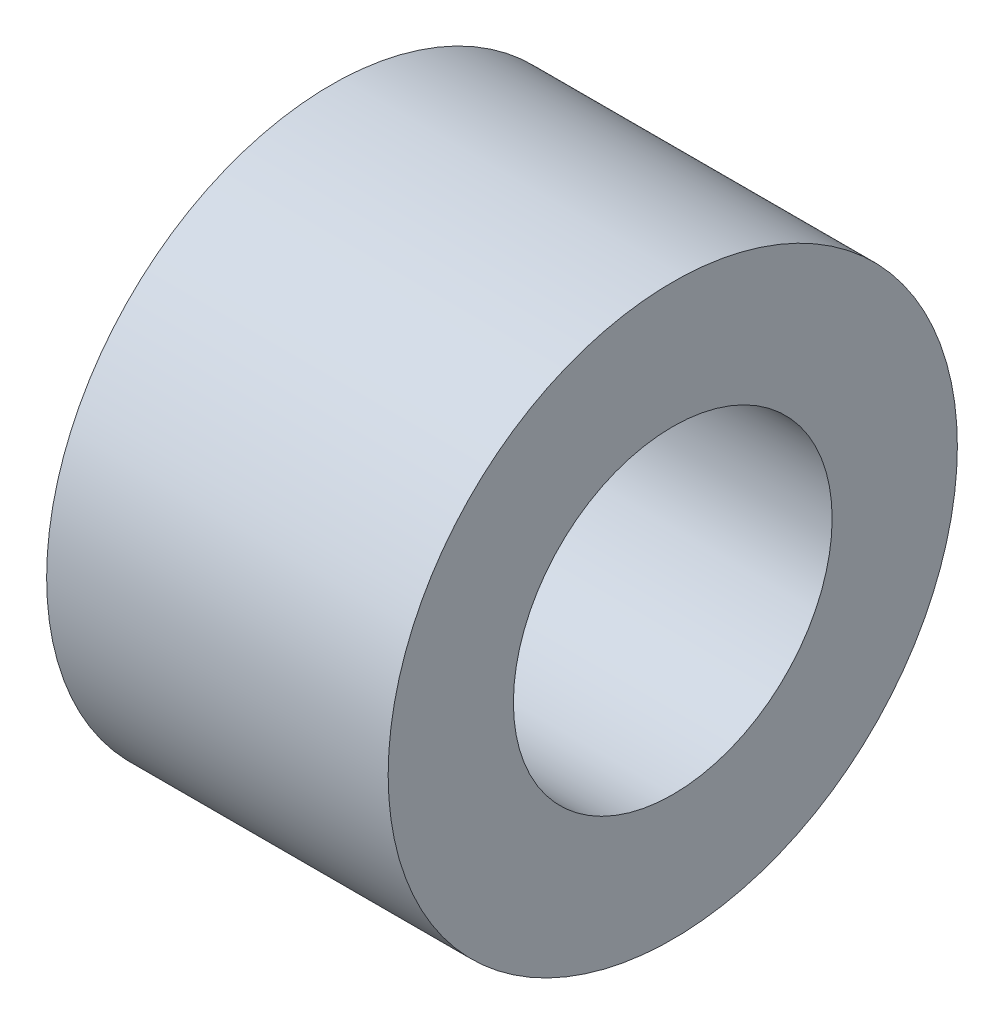
ISO-10303-21;
HEADER;
FILE_DESCRIPTION(('STEP AP214'),'2;1');
FILE_NAME('part.step','',(''),(''),'','','');
FILE_SCHEMA(('AUTOMOTIVE_DESIGN { 1 0 10303 214 1 1 1 1 }'));
ENDSEC;
DATA;
#1=APPLICATION_CONTEXT('core data for automotive mechanical design processes');
#2=APPLICATION_PROTOCOL_DEFINITION('international standard','automotive_design',2000,#1);
#3=PRODUCT_CONTEXT('',#1,'mechanical');
#4=PRODUCT('Part','Part','',(#3));
#5=PRODUCT_RELATED_PRODUCT_CATEGORY('part','',(#4));
#6=PRODUCT_DEFINITION_FORMATION('','',#4);
#7=PRODUCT_DEFINITION_CONTEXT('part definition',#1,'design');
#8=PRODUCT_DEFINITION('design','',#6,#7);
#9=PRODUCT_DEFINITION_SHAPE('','',#8);
#10=(LENGTH_UNIT() NAMED_UNIT(*) SI_UNIT(.MILLI.,.METRE.));
#11=(NAMED_UNIT(*) PLANE_ANGLE_UNIT() SI_UNIT($,.RADIAN.));
#12=(NAMED_UNIT(*) SI_UNIT($,.STERADIAN.) SOLID_ANGLE_UNIT());
#13=UNCERTAINTY_MEASURE_WITH_UNIT(LENGTH_MEASURE(1.E-05),#10,'distance_accuracy_value','');
#14=(GEOMETRIC_REPRESENTATION_CONTEXT(3) GLOBAL_UNCERTAINTY_ASSIGNED_CONTEXT((#13)) GLOBAL_UNIT_ASSIGNED_CONTEXT((#10,
#11,#12)) REPRESENTATION_CONTEXT('',''));
#15=CARTESIAN_POINT('',(0.,0.,0.));
#16=DIRECTION('',(0.,0.,1.));
#17=DIRECTION('',(1.,0.,0.));
#18=AXIS2_PLACEMENT_3D('',#15,#16,#17);
#19=CARTESIAN_POINT('',(3.,0.,0.));
#20=DIRECTION('',(1.,0.,0.));
#21=DIRECTION('',(0.,0.,-1.));
#22=AXIS2_PLACEMENT_3D('',#19,#20,#21);
#23=PLANE('',#22);
#24=CARTESIAN_POINT('',(3.,0.,0.));
#25=DIRECTION('',(1.,0.,0.));
#26=DIRECTION('',(0.,0.,-1.));
#27=AXIS2_PLACEMENT_3D('',#24,#25,#26);
#28=CIRCLE('',#27,2.5);
#29=CARTESIAN_POINT('',(3.,0.,-2.5));
#30=VERTEX_POINT('',#29);
#31=EDGE_CURVE('E11',#30,#30,#28,.T.);
#32=ORIENTED_EDGE('',*,*,#31,.T.);
#33=EDGE_LOOP('',(#32));
#34=FACE_BOUND('',#33,.T.);
#35=CARTESIAN_POINT('',(3.,0.,0.));
#36=DIRECTION('',(1.,0.,0.));
#37=DIRECTION('',(0.,0.,-1.));
#38=AXIS2_PLACEMENT_3D('',#35,#36,#37);
#39=CIRCLE('',#38,1.4);
#40=CARTESIAN_POINT('',(3.,0.,-1.4));
#41=VERTEX_POINT('',#40);
#42=EDGE_CURVE('E53',#41,#41,#39,.T.);
#43=ORIENTED_EDGE('',*,*,#42,.F.);
#44=EDGE_LOOP('',(#43));
#45=FACE_BOUND('',#44,.T.);
#46=ADVANCED_FACE('F43',(#34,#45),#23,.T.);
#47=CARTESIAN_POINT('',(0.,0.,0.));
#48=DIRECTION('',(1.,0.,0.));
#49=DIRECTION('',(0.,0.,-1.));
#50=AXIS2_PLACEMENT_3D('',#47,#48,#49);
#51=PLANE('',#50);
#52=CARTESIAN_POINT('',(0.,0.,0.));
#53=DIRECTION('',(1.,0.,0.));
#54=DIRECTION('',(0.,0.,-1.));
#55=AXIS2_PLACEMENT_3D('',#52,#53,#54);
#56=CIRCLE('',#55,2.5);
#57=CARTESIAN_POINT('',(0.,0.,-2.5));
#58=VERTEX_POINT('',#57);
#59=EDGE_CURVE('E50',#58,#58,#56,.T.);
#60=ORIENTED_EDGE('',*,*,#59,.F.);
#61=EDGE_LOOP('',(#60));
#62=FACE_BOUND('',#61,.T.);
#63=CARTESIAN_POINT('',(0.,0.,0.));
#64=DIRECTION('',(1.,0.,0.));
#65=DIRECTION('',(0.,0.,-1.));
#66=AXIS2_PLACEMENT_3D('',#63,#64,#65);
#67=CIRCLE('',#66,1.4);
#68=CARTESIAN_POINT('',(0.,0.,-1.4));
#69=VERTEX_POINT('',#68);
#70=EDGE_CURVE('E57',#69,#69,#67,.T.);
#71=ORIENTED_EDGE('',*,*,#70,.T.);
#72=EDGE_LOOP('',(#71));
#73=FACE_BOUND('',#72,.T.);
#74=ADVANCED_FACE('F67',(#62,#73),#51,.F.);
#75=CARTESIAN_POINT('',(3.,0.,0.));
#76=DIRECTION('',(-1.,0.,0.));
#77=DIRECTION('',(0.,0.,1.));
#78=AXIS2_PLACEMENT_3D('',#75,#76,#77);
#79=CYLINDRICAL_SURFACE('',#78,2.5);
#80=ORIENTED_EDGE('',*,*,#31,.F.);
#81=EDGE_LOOP('',(#80));
#82=FACE_BOUND('',#81,.T.);
#83=ORIENTED_EDGE('',*,*,#59,.T.);
#84=EDGE_LOOP('',(#83));
#85=FACE_BOUND('',#84,.T.);
#86=ADVANCED_FACE('F44',(#82,#85),#79,.T.);
#87=CARTESIAN_POINT('',(3.,0.,0.));
#88=DIRECTION('',(-1.,0.,0.));
#89=DIRECTION('',(0.,0.,1.));
#90=AXIS2_PLACEMENT_3D('',#87,#88,#89);
#91=CYLINDRICAL_SURFACE('',#90,1.4);
#92=ORIENTED_EDGE('',*,*,#42,.T.);
#93=EDGE_LOOP('',(#92));
#94=FACE_BOUND('',#93,.T.);
#95=ORIENTED_EDGE('',*,*,#70,.F.);
#96=EDGE_LOOP('',(#95));
#97=FACE_BOUND('',#96,.T.);
#98=ADVANCED_FACE('F64',(#94,#97),#91,.F.);
#99=CLOSED_SHELL('',(#46,#74,#86,#98));
#100=MANIFOLD_SOLID_BREP('B2',#99);
#101=ADVANCED_BREP_SHAPE_REPRESENTATION('',(#18,#100),#14);
#102=SHAPE_DEFINITION_REPRESENTATION(#9,#101);
ENDSEC;
END-ISO-10303-21;
